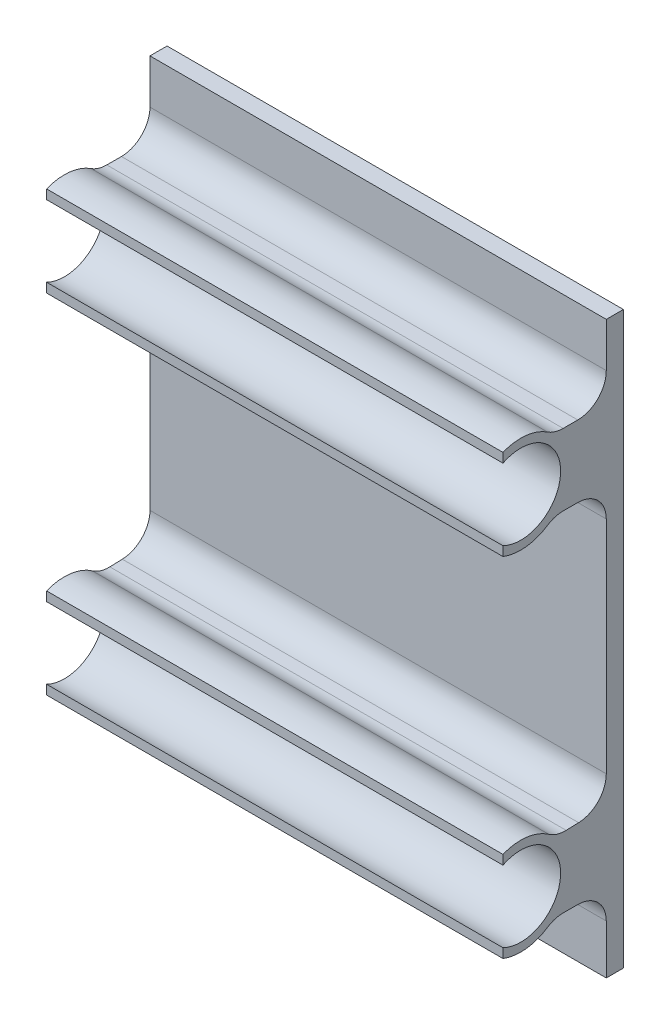
ISO-10303-21;
HEADER;
FILE_DESCRIPTION(('STEP AP214'),'2;1');
FILE_NAME('part.step','',(''),(''),'','','');
FILE_SCHEMA(('AUTOMOTIVE_DESIGN { 1 0 10303 214 1 1 1 1 }'));
ENDSEC;
DATA;
#1=APPLICATION_CONTEXT('core data for automotive mechanical design processes');
#2=APPLICATION_PROTOCOL_DEFINITION('international standard','automotive_design',2000,#1);
#3=PRODUCT_CONTEXT('',#1,'mechanical');
#4=PRODUCT('Part','Part','',(#3));
#5=PRODUCT_RELATED_PRODUCT_CATEGORY('part','',(#4));
#6=PRODUCT_DEFINITION_FORMATION('','',#4);
#7=PRODUCT_DEFINITION_CONTEXT('part definition',#1,'design');
#8=PRODUCT_DEFINITION('design','',#6,#7);
#9=PRODUCT_DEFINITION_SHAPE('','',#8);
#10=(LENGTH_UNIT() NAMED_UNIT(*) SI_UNIT(.MILLI.,.METRE.));
#11=(NAMED_UNIT(*) PLANE_ANGLE_UNIT() SI_UNIT($,.RADIAN.));
#12=(NAMED_UNIT(*) SI_UNIT($,.STERADIAN.) SOLID_ANGLE_UNIT());
#13=UNCERTAINTY_MEASURE_WITH_UNIT(LENGTH_MEASURE(1.E-05),#10,'distance_accuracy_value','');
#14=(GEOMETRIC_REPRESENTATION_CONTEXT(3) GLOBAL_UNCERTAINTY_ASSIGNED_CONTEXT((#13)) GLOBAL_UNIT_ASSIGNED_CONTEXT((#10,
#11,#12)) REPRESENTATION_CONTEXT('',''));
#15=CARTESIAN_POINT('',(0.,0.,0.));
#16=DIRECTION('',(0.,0.,1.));
#17=DIRECTION('',(1.,0.,0.));
#18=AXIS2_PLACEMENT_3D('',#15,#16,#17);
#19=CARTESIAN_POINT('',(0.,0.,3.));
#20=DIRECTION('',(0.,0.,-1.));
#21=DIRECTION('',(-1.,0.,0.));
#22=AXIS2_PLACEMENT_3D('',#19,#20,#21);
#23=PLANE('',#22);
#24=DIRECTION('',(0.,-1.,0.));
#25=VECTOR('',#24,1.);
#26=CARTESIAN_POINT('',(-21.5633463121759,-41.2326892611324,3.));
#27=LINE('',#26,#25);
#28=CARTESIAN_POINT('',(-21.5633463121759,28.4568046704941,3.));
#29=VERTEX_POINT('',#28);
#30=CARTESIAN_POINT('',(-21.5633463121759,-10.2291267439927,3.));
#31=VERTEX_POINT('',#30);
#32=EDGE_CURVE('E367',#29,#31,#27,.T.);
#33=ORIENTED_EDGE('',*,*,#32,.T.);
#34=DIRECTION('',(1.,0.,0.));
#35=VECTOR('',#34,1.);
#36=CARTESIAN_POINT('',(0.,-10.2291267439927,3.));
#37=LINE('',#36,#35);
#38=CARTESIAN_POINT('',(58.4366536878241,-10.2291267439927,3.));
#39=VERTEX_POINT('',#38);
#40=EDGE_CURVE('E466',#31,#39,#37,.T.);
#41=ORIENTED_EDGE('',*,*,#40,.T.);
#42=DIRECTION('',(0.,1.,0.));
#43=VECTOR('',#42,1.);
#44=CARTESIAN_POINT('',(58.4366536878241,58.7673107388676,3.));
#45=LINE('',#44,#43);
#46=CARTESIAN_POINT('',(58.4366536878241,28.4568046704941,3.));
#47=VERTEX_POINT('',#46);
#48=EDGE_CURVE('E377',#39,#47,#45,.T.);
#49=ORIENTED_EDGE('',*,*,#48,.T.);
#50=DIRECTION('',(-1.,0.,0.));
#51=VECTOR('',#50,1.);
#52=CARTESIAN_POINT('',(0.,28.4568046704941,3.));
#53=LINE('',#52,#51);
#54=EDGE_CURVE('E462',#47,#29,#53,.T.);
#55=ORIENTED_EDGE('',*,*,#54,.T.);
#56=EDGE_LOOP('',(#33,#41,#49,#55));
#57=FACE_BOUND('',#56,.T.);
#58=ADVANCED_FACE('F42',(#57),#23,.F.);
#59=CARTESIAN_POINT('',(-21.5633463121759,58.7673107388676,3.));
#60=VERTEX_POINT('',#59);
#61=CARTESIAN_POINT('',(-21.5633463121759,50.9913142501567,3.));
#62=VERTEX_POINT('',#61);
#63=EDGE_CURVE('E362',#60,#62,#27,.T.);
#64=ORIENTED_EDGE('',*,*,#63,.T.);
#65=DIRECTION('',(1.,0.,0.));
#66=VECTOR('',#65,1.);
#67=CARTESIAN_POINT('',(0.,50.9913142501567,3.));
#68=LINE('',#67,#66);
#69=CARTESIAN_POINT('',(58.4366536878241,50.9913142501567,3.));
#70=VERTEX_POINT('',#69);
#71=EDGE_CURVE('E483',#62,#70,#68,.T.);
#72=ORIENTED_EDGE('',*,*,#71,.T.);
#73=CARTESIAN_POINT('',(58.4366536878241,58.7673107388676,3.));
#74=VERTEX_POINT('',#73);
#75=EDGE_CURVE('E371',#70,#74,#45,.T.);
#76=ORIENTED_EDGE('',*,*,#75,.T.);
#77=DIRECTION('',(-1.,0.,0.));
#78=VECTOR('',#77,1.);
#79=CARTESIAN_POINT('',(-21.5633463121759,58.7673107388676,3.));
#80=LINE('',#79,#78);
#81=EDGE_CURVE('E376',#74,#60,#80,.T.);
#82=ORIENTED_EDGE('',*,*,#81,.T.);
#83=EDGE_LOOP('',(#64,#72,#76,#82));
#84=FACE_BOUND('',#83,.T.);
#85=ADVANCED_FACE('F576',(#84),#23,.F.);
#86=CARTESIAN_POINT('',(-21.5633463121759,-41.2326892611324,3.));
#87=DIRECTION('',(1.,0.,0.));
#88=DIRECTION('',(0.,0.,-1.));
#89=AXIS2_PLACEMENT_3D('',#86,#87,#88);
#90=PLANE('',#89);
#91=DIRECTION('',(0.,-0.0306969973347447,0.999528736132499));
#92=VECTOR('',#91,1.);
#93=CARTESIAN_POINT('',(-21.5633463121759,-15.0422169277016,1.83724571746385));
#94=LINE('',#93,#92);
#95=CARTESIAN_POINT('',(-21.5633463121759,-15.2267704246552,7.84651501332628));
#96=VERTEX_POINT('',#95);
#97=CARTESIAN_POINT('',(-21.5633463121759,-15.2940929711581,10.0386127968808));
#98=VERTEX_POINT('',#97);
#99=EDGE_CURVE('E283',#96,#98,#94,.T.);
#100=ORIENTED_EDGE('',*,*,#99,.F.);
#101=CARTESIAN_POINT('',(-21.5633463121759,-10.2291267439927,8.));
#102=DIRECTION('',(1.,0.,0.));
#103=DIRECTION('',(0.,0.,-1.));
#104=AXIS2_PLACEMENT_3D('',#101,#102,#103);
#105=CIRCLE('',#104,5.);
#106=EDGE_CURVE('E492',#96,#31,#105,.T.);
#107=ORIENTED_EDGE('',*,*,#106,.T.);
#108=ORIENTED_EDGE('',*,*,#32,.F.);
#109=CARTESIAN_POINT('',(-21.5633463121759,28.4568046704941,8.));
#110=DIRECTION('',(1.,0.,0.));
#111=DIRECTION('',(0.,0.,-1.));
#112=AXIS2_PLACEMENT_3D('',#109,#110,#111);
#113=CIRCLE('',#112,5.);
#114=CARTESIAN_POINT('',(-21.5633463121759,33.4568046704941,8.));
#115=VERTEX_POINT('',#114);
#116=EDGE_CURVE('E501',#29,#115,#113,.T.);
#117=ORIENTED_EDGE('',*,*,#116,.T.);
#118=DIRECTION('',(0.,0.,-1.));
#119=VECTOR('',#118,1.);
#120=CARTESIAN_POINT('',(-21.5633463121759,33.4568046704941,1.83724571746385));
#121=LINE('',#120,#119);
#122=CARTESIAN_POINT('',(-21.5633463121759,33.4568046704941,10.5636723108094));
#123=VERTEX_POINT('',#122);
#124=EDGE_CURVE('E310',#123,#115,#121,.T.);
#125=ORIENTED_EDGE('',*,*,#124,.F.);
#126=CARTESIAN_POINT('',(-21.5633463121759,28.4568046704941,10.5636723108094));
#127=DIRECTION('',(1.,0.,0.));
#128=DIRECTION('',(0.,0.,-1.));
#129=AXIS2_PLACEMENT_3D('',#126,#127,#128);
#130=CIRCLE('',#129,5.);
#131=CARTESIAN_POINT('',(-21.5633463121759,32.6298620000612,13.3178677512503));
#132=VERTEX_POINT('',#131);
#133=EDGE_CURVE('E452',#123,#132,#130,.T.);
#134=ORIENTED_EDGE('',*,*,#133,.T.);
#135=CARTESIAN_POINT('',(-21.5633463121759,39.7240594603254,18.));
#136=DIRECTION('',(1.,0.,0.));
#137=DIRECTION('',(0.,0.,-1.));
#138=AXIS2_PLACEMENT_3D('',#135,#136,#137);
#139=CIRCLE('',#138,8.5);
#140=CARTESIAN_POINT('',(-21.5633463121759,31.816564117256,21.1179347971593));
#141=VERTEX_POINT('',#140);
#142=EDGE_CURVE('E306',#141,#132,#139,.T.);
#143=ORIENTED_EDGE('',*,*,#142,.F.);
#144=DIRECTION('',(0.,-1.,0.));
#145=VECTOR('',#144,1.);
#146=CARTESIAN_POINT('',(-21.5633463121759,33.4568046704941,21.1179347971593));
#147=LINE('',#146,#145);
#148=CARTESIAN_POINT('',(-21.5633463121759,33.4568046704941,21.1179347971593));
#149=VERTEX_POINT('',#148);
#150=EDGE_CURVE('E301',#149,#141,#147,.T.);
#151=ORIENTED_EDGE('',*,*,#150,.F.);
#152=CARTESIAN_POINT('',(-21.5633463121759,39.7240594603254,18.));
#153=DIRECTION('',(-1.,0.,0.));
#154=DIRECTION('',(0.,0.,-1.));
#155=AXIS2_PLACEMENT_3D('',#152,#153,#154);
#156=CIRCLE('',#155,7.);
#157=CARTESIAN_POINT('',(-21.5633463121759,45.9913142501567,21.1179347971593));
#158=VERTEX_POINT('',#157);
#159=EDGE_CURVE('E297',#158,#149,#156,.T.);
#160=ORIENTED_EDGE('',*,*,#159,.F.);
#161=DIRECTION('',(0.,-1.,0.));
#162=VECTOR('',#161,1.);
#163=CARTESIAN_POINT('',(-21.5633463121759,47.6315548033947,21.1179347971593));
#164=LINE('',#163,#162);
#165=CARTESIAN_POINT('',(-21.5633463121759,47.6315548033947,21.1179347971593));
#166=VERTEX_POINT('',#165);
#167=EDGE_CURVE('E320',#166,#158,#164,.T.);
#168=ORIENTED_EDGE('',*,*,#167,.F.);
#169=CARTESIAN_POINT('',(-21.5633463121759,39.7240594603254,18.));
#170=DIRECTION('',(1.,0.,0.));
#171=DIRECTION('',(0.,0.,-1.));
#172=AXIS2_PLACEMENT_3D('',#169,#170,#171);
#173=CIRCLE('',#172,8.5);
#174=CARTESIAN_POINT('',(-21.5633463121759,46.8182569205895,13.3178677512503));
#175=VERTEX_POINT('',#174);
#176=EDGE_CURVE('E317',#175,#166,#173,.T.);
#177=ORIENTED_EDGE('',*,*,#176,.F.);
#178=CARTESIAN_POINT('',(-21.5633463121759,50.9913142501567,10.5636723108094));
#179=DIRECTION('',(1.,0.,0.));
#180=DIRECTION('',(0.,0.,-1.));
#181=AXIS2_PLACEMENT_3D('',#178,#179,#180);
#182=CIRCLE('',#181,5.);
#183=CARTESIAN_POINT('',(-21.5633463121759,45.9913142501567,10.5636723108094));
#184=VERTEX_POINT('',#183);
#185=EDGE_CURVE('E458',#175,#184,#182,.T.);
#186=ORIENTED_EDGE('',*,*,#185,.T.);
#187=DIRECTION('',(0.,0.,1.));
#188=VECTOR('',#187,1.);
#189=CARTESIAN_POINT('',(-21.5633463121759,45.9913142501567,1.83724571746385));
#190=LINE('',#189,#188);
#191=CARTESIAN_POINT('',(-21.5633463121759,45.9913142501567,8.));
#192=VERTEX_POINT('',#191);
#193=EDGE_CURVE('E314',#192,#184,#190,.T.);
#194=ORIENTED_EDGE('',*,*,#193,.F.);
#195=CARTESIAN_POINT('',(-21.5633463121759,50.9913142501567,8.));
#196=DIRECTION('',(1.,0.,0.));
#197=DIRECTION('',(0.,0.,-1.));
#198=AXIS2_PLACEMENT_3D('',#195,#196,#197);
#199=CIRCLE('',#198,5.);
#200=EDGE_CURVE('E11',#192,#62,#199,.T.);
#201=ORIENTED_EDGE('',*,*,#200,.T.);
#202=ORIENTED_EDGE('',*,*,#63,.F.);
#203=DIRECTION('',(0.,0.,-1.));
#204=VECTOR('',#203,1.);
#205=CARTESIAN_POINT('',(-21.5633463121759,58.7673107388676,3.));
#206=LINE('',#205,#204);
#207=CARTESIAN_POINT('',(-21.5633463121759,58.7673107388676,0.));
#208=VERTEX_POINT('',#207);
#209=EDGE_CURVE('E380',#60,#208,#206,.T.);
#210=ORIENTED_EDGE('',*,*,#209,.T.);
#211=DIRECTION('',(0.,-1.,0.));
#212=VECTOR('',#211,1.);
#213=CARTESIAN_POINT('',(-21.5633463121759,-41.2326892611324,0.));
#214=LINE('',#213,#212);
#215=CARTESIAN_POINT('',(-21.5633463121759,-41.2326892611324,0.));
#216=VERTEX_POINT('',#215);
#217=EDGE_CURVE('E352',#208,#216,#214,.T.);
#218=ORIENTED_EDGE('',*,*,#217,.T.);
#219=DIRECTION('',(0.,0.,-1.));
#220=VECTOR('',#219,1.);
#221=CARTESIAN_POINT('',(-21.5633463121759,-41.2326892611324,3.));
#222=LINE('',#221,#220);
#223=CARTESIAN_POINT('',(-21.5633463121759,-41.2326892611324,3.));
#224=VERTEX_POINT('',#223);
#225=EDGE_CURVE('E404',#224,#216,#222,.T.);
#226=ORIENTED_EDGE('',*,*,#225,.F.);
#227=CARTESIAN_POINT('',(-21.5633463121759,-32.5767265073642,3.));
#228=VERTEX_POINT('',#227);
#229=EDGE_CURVE('E368',#228,#224,#27,.T.);
#230=ORIENTED_EDGE('',*,*,#229,.F.);
#231=CARTESIAN_POINT('',(-21.5633463121759,-32.5767265073642,8.));
#232=DIRECTION('',(1.,0.,0.));
#233=DIRECTION('',(0.,0.,-1.));
#234=AXIS2_PLACEMENT_3D('',#231,#232,#233);
#235=CIRCLE('',#234,5.);
#236=CARTESIAN_POINT('',(-21.5633463121759,-27.5767265073642,8.));
#237=VERTEX_POINT('',#236);
#238=EDGE_CURVE('E495',#228,#237,#235,.T.);
#239=ORIENTED_EDGE('',*,*,#238,.T.);
#240=DIRECTION('',(0.,0.,-1.));
#241=VECTOR('',#240,1.);
#242=CARTESIAN_POINT('',(-21.5633463121759,-27.5767265073642,1.83724571746385));
#243=LINE('',#242,#241);
#244=CARTESIAN_POINT('',(-21.5633463121759,-27.5767265073642,10.5636723108093));
#245=VERTEX_POINT('',#244);
#246=EDGE_CURVE('E286',#245,#237,#243,.T.);
#247=ORIENTED_EDGE('',*,*,#246,.F.);
#248=CARTESIAN_POINT('',(-21.5633463121759,-32.5767265073642,10.5636723108093));
#249=DIRECTION('',(1.,0.,0.));
#250=DIRECTION('',(0.,0.,-1.));
#251=AXIS2_PLACEMENT_3D('',#248,#249,#250);
#252=CIRCLE('',#251,5.);
#253=CARTESIAN_POINT('',(-21.5633463121759,-28.4036691777971,13.3178677512503));
#254=VERTEX_POINT('',#253);
#255=EDGE_CURVE('E439',#245,#254,#252,.T.);
#256=ORIENTED_EDGE('',*,*,#255,.T.);
#257=CARTESIAN_POINT('',(-21.5633463121759,-21.3094717175329,18.));
#258=DIRECTION('',(1.,0.,0.));
#259=DIRECTION('',(0.,0.,-1.));
#260=AXIS2_PLACEMENT_3D('',#257,#258,#259);
#261=CIRCLE('',#260,8.5);
#262=CARTESIAN_POINT('',(-21.5633463121759,-29.2169670606023,21.1179347971593));
#263=VERTEX_POINT('',#262);
#264=EDGE_CURVE('E290',#263,#254,#261,.T.);
#265=ORIENTED_EDGE('',*,*,#264,.F.);
#266=DIRECTION('',(0.,-1.,0.));
#267=VECTOR('',#266,1.);
#268=CARTESIAN_POINT('',(-21.5633463121759,-27.5767265073642,21.1179347971593));
#269=LINE('',#268,#267);
#270=CARTESIAN_POINT('',(-21.5633463121759,-27.5767265073642,21.1179347971593));
#271=VERTEX_POINT('',#270);
#272=EDGE_CURVE('E262',#271,#263,#269,.T.);
#273=ORIENTED_EDGE('',*,*,#272,.F.);
#274=CARTESIAN_POINT('',(-21.5633463121759,-21.3094717175329,18.));
#275=DIRECTION('',(-1.,0.,0.));
#276=DIRECTION('',(0.,0.,-1.));
#277=AXIS2_PLACEMENT_3D('',#274,#275,#276);
#278=CIRCLE('',#277,7.);
#279=CARTESIAN_POINT('',(-21.5633463121759,-15.0422169277016,21.1179347971593));
#280=VERTEX_POINT('',#279);
#281=EDGE_CURVE('E256',#280,#271,#278,.T.);
#282=ORIENTED_EDGE('',*,*,#281,.F.);
#283=DIRECTION('',(0.,-1.,0.));
#284=VECTOR('',#283,1.);
#285=CARTESIAN_POINT('',(-21.5633463121759,-13.4019763744636,21.1179347971593));
#286=LINE('',#285,#284);
#287=CARTESIAN_POINT('',(-21.5633463121759,-13.4019763744636,21.1179347971593));
#288=VERTEX_POINT('',#287);
#289=EDGE_CURVE('E233',#288,#280,#286,.T.);
#290=ORIENTED_EDGE('',*,*,#289,.F.);
#291=CARTESIAN_POINT('',(-21.5633463121759,-21.3094717175329,18.));
#292=DIRECTION('',(1.,0.,0.));
#293=DIRECTION('',(0.,0.,-1.));
#294=AXIS2_PLACEMENT_3D('',#291,#292,#293);
#295=CIRCLE('',#294,8.5);
#296=CARTESIAN_POINT('',(-21.5633463121759,-14.3753464856946,13.0839134192751));
#297=VERTEX_POINT('',#296);
#298=EDGE_CURVE('E280',#297,#288,#295,.T.);
#299=ORIENTED_EDGE('',*,*,#298,.F.);
#300=CARTESIAN_POINT('',(-21.5633463121759,-10.2964492904956,10.1920977835546));
#301=DIRECTION('',(1.,0.,0.));
#302=DIRECTION('',(0.,0.,-1.));
#303=AXIS2_PLACEMENT_3D('',#300,#301,#302);
#304=CIRCLE('',#303,5.);
#305=EDGE_CURVE('E445',#297,#98,#304,.T.);
#306=ORIENTED_EDGE('',*,*,#305,.T.);
#307=EDGE_LOOP('',(#100,#107,#108,#117,#125,#134,#143,#151,#160,#168,#177,#186,#194,#201,#202,
#210,#218,#226,#230,#239,#247,#256,#265,#273,#282,#290,#299,#306));
#308=FACE_BOUND('',#307,.T.);
#309=ADVANCED_FACE('F525',(#308),#90,.F.);
#310=CARTESIAN_POINT('',(58.4366536878241,-41.2326892611324,3.));
#311=DIRECTION('',(0.,1.,0.));
#312=DIRECTION('',(-1.,0.,0.));
#313=AXIS2_PLACEMENT_3D('',#310,#311,#312);
#314=PLANE('',#313);
#315=DIRECTION('',(1.,0.,0.));
#316=VECTOR('',#315,1.);
#317=CARTESIAN_POINT('',(58.4366536878241,-41.2326892611324,0.));
#318=LINE('',#317,#316);
#319=CARTESIAN_POINT('',(58.4366536878241,-41.2326892611324,0.));
#320=VERTEX_POINT('',#319);
#321=EDGE_CURVE('E384',#216,#320,#318,.T.);
#322=ORIENTED_EDGE('',*,*,#321,.T.);
#323=DIRECTION('',(0.,0.,-1.));
#324=VECTOR('',#323,1.);
#325=CARTESIAN_POINT('',(58.4366536878241,-41.2326892611324,3.));
#326=LINE('',#325,#324);
#327=CARTESIAN_POINT('',(58.4366536878241,-41.2326892611324,3.));
#328=VERTEX_POINT('',#327);
#329=EDGE_CURVE('E400',#328,#320,#326,.T.);
#330=ORIENTED_EDGE('',*,*,#329,.F.);
#331=DIRECTION('',(1.,0.,0.));
#332=VECTOR('',#331,1.);
#333=CARTESIAN_POINT('',(58.4366536878241,-41.2326892611324,3.));
#334=LINE('',#333,#332);
#335=EDGE_CURVE('E366',#224,#328,#334,.T.);
#336=ORIENTED_EDGE('',*,*,#335,.F.);
#337=ORIENTED_EDGE('',*,*,#225,.T.);
#338=EDGE_LOOP('',(#322,#330,#336,#337));
#339=FACE_BOUND('',#338,.T.);
#340=ADVANCED_FACE('F522',(#339),#314,.F.);
#341=CARTESIAN_POINT('',(58.4366536878241,58.7673107388676,3.));
#342=DIRECTION('',(-1.,0.,0.));
#343=DIRECTION('',(0.,0.,1.));
#344=AXIS2_PLACEMENT_3D('',#341,#342,#343);
#345=PLANE('',#344);
#346=ORIENTED_EDGE('',*,*,#48,.F.);
#347=CARTESIAN_POINT('',(58.4366536878241,-10.2291267439927,8.));
#348=DIRECTION('',(-1.,0.,0.));
#349=DIRECTION('',(0.,0.,1.));
#350=AXIS2_PLACEMENT_3D('',#347,#348,#349);
#351=CIRCLE('',#350,5.);
#352=CARTESIAN_POINT('',(58.4366536878241,-15.2267704246552,7.84651501332628));
#353=VERTEX_POINT('',#352);
#354=EDGE_CURVE('E489',#39,#353,#351,.T.);
#355=ORIENTED_EDGE('',*,*,#354,.T.);
#356=DIRECTION('',(0.,-0.0306969973347447,0.999528736132499));
#357=VECTOR('',#356,1.);
#358=CARTESIAN_POINT('',(58.4366536878241,-15.0422169277016,1.83724571746385));
#359=LINE('',#358,#357);
#360=CARTESIAN_POINT('',(58.4366536878241,-15.2940929711581,10.0386127968808));
#361=VERTEX_POINT('',#360);
#362=EDGE_CURVE('E260',#353,#361,#359,.T.);
#363=ORIENTED_EDGE('',*,*,#362,.T.);
#364=CARTESIAN_POINT('',(58.4366536878241,-10.2964492904956,10.1920977835546));
#365=DIRECTION('',(-1.,0.,0.));
#366=DIRECTION('',(0.,0.,1.));
#367=AXIS2_PLACEMENT_3D('',#364,#365,#366);
#368=CIRCLE('',#367,5.);
#369=CARTESIAN_POINT('',(58.4366536878241,-14.3753464856946,13.0839134192751));
#370=VERTEX_POINT('',#369);
#371=EDGE_CURVE('E442',#361,#370,#368,.T.);
#372=ORIENTED_EDGE('',*,*,#371,.T.);
#373=CARTESIAN_POINT('',(58.4366536878241,-21.3094717175329,18.));
#374=DIRECTION('',(1.,0.,0.));
#375=DIRECTION('',(0.,0.,-1.));
#376=AXIS2_PLACEMENT_3D('',#373,#374,#375);
#377=CIRCLE('',#376,8.5);
#378=CARTESIAN_POINT('',(58.4366536878241,-13.4019763744636,21.1179347971593));
#379=VERTEX_POINT('',#378);
#380=EDGE_CURVE('E253',#370,#379,#377,.T.);
#381=ORIENTED_EDGE('',*,*,#380,.T.);
#382=DIRECTION('',(0.,-1.,0.));
#383=VECTOR('',#382,1.);
#384=CARTESIAN_POINT('',(58.4366536878241,-13.4019763744636,21.1179347971593));
#385=LINE('',#384,#383);
#386=CARTESIAN_POINT('',(58.4366536878241,-15.0422169277016,21.1179347971593));
#387=VERTEX_POINT('',#386);
#388=EDGE_CURVE('E231',#379,#387,#385,.T.);
#389=ORIENTED_EDGE('',*,*,#388,.T.);
#390=CARTESIAN_POINT('',(58.4366536878241,-21.3094717175329,18.));
#391=DIRECTION('',(-1.,0.,0.));
#392=DIRECTION('',(0.,0.,-1.));
#393=AXIS2_PLACEMENT_3D('',#390,#391,#392);
#394=CIRCLE('',#393,7.);
#395=CARTESIAN_POINT('',(58.4366536878241,-27.5767265073642,21.1179347971593));
#396=VERTEX_POINT('',#395);
#397=EDGE_CURVE('E241',#387,#396,#394,.T.);
#398=ORIENTED_EDGE('',*,*,#397,.T.);
#399=DIRECTION('',(0.,-1.,0.));
#400=VECTOR('',#399,1.);
#401=CARTESIAN_POINT('',(58.4366536878241,-27.5767265073642,21.1179347971593));
#402=LINE('',#401,#400);
#403=CARTESIAN_POINT('',(58.4366536878241,-29.2169670606023,21.1179347971593));
#404=VERTEX_POINT('',#403);
#405=EDGE_CURVE('E248',#396,#404,#402,.T.);
#406=ORIENTED_EDGE('',*,*,#405,.T.);
#407=CARTESIAN_POINT('',(58.4366536878241,-21.3094717175329,18.));
#408=DIRECTION('',(1.,0.,0.));
#409=DIRECTION('',(0.,0.,-1.));
#410=AXIS2_PLACEMENT_3D('',#407,#408,#409);
#411=CIRCLE('',#410,8.5);
#412=CARTESIAN_POINT('',(58.4366536878241,-28.4036691777971,13.3178677512503));
#413=VERTEX_POINT('',#412);
#414=EDGE_CURVE('E272',#404,#413,#411,.T.);
#415=ORIENTED_EDGE('',*,*,#414,.T.);
#416=CARTESIAN_POINT('',(58.4366536878241,-32.5767265073642,10.5636723108093));
#417=DIRECTION('',(-1.,0.,0.));
#418=DIRECTION('',(0.,0.,1.));
#419=AXIS2_PLACEMENT_3D('',#416,#417,#418);
#420=CIRCLE('',#419,5.);
#421=CARTESIAN_POINT('',(58.4366536878241,-27.5767265073642,10.5636723108093));
#422=VERTEX_POINT('',#421);
#423=EDGE_CURVE('E436',#413,#422,#420,.T.);
#424=ORIENTED_EDGE('',*,*,#423,.T.);
#425=DIRECTION('',(0.,0.,-1.));
#426=VECTOR('',#425,1.);
#427=CARTESIAN_POINT('',(58.4366536878241,-27.5767265073642,1.83724571746385));
#428=LINE('',#427,#426);
#429=CARTESIAN_POINT('',(58.4366536878241,-27.5767265073642,8.));
#430=VERTEX_POINT('',#429);
#431=EDGE_CURVE('E268',#422,#430,#428,.T.);
#432=ORIENTED_EDGE('',*,*,#431,.T.);
#433=CARTESIAN_POINT('',(58.4366536878241,-32.5767265073642,8.));
#434=DIRECTION('',(-1.,0.,0.));
#435=DIRECTION('',(0.,0.,1.));
#436=AXIS2_PLACEMENT_3D('',#433,#434,#435);
#437=CIRCLE('',#436,5.);
#438=CARTESIAN_POINT('',(58.4366536878241,-32.5767265073643,3.));
#439=VERTEX_POINT('',#438);
#440=EDGE_CURVE('E498',#430,#439,#437,.T.);
#441=ORIENTED_EDGE('',*,*,#440,.T.);
#442=EDGE_CURVE('E372',#328,#439,#45,.T.);
#443=ORIENTED_EDGE('',*,*,#442,.F.);
#444=ORIENTED_EDGE('',*,*,#329,.T.);
#445=DIRECTION('',(0.,1.,0.));
#446=VECTOR('',#445,1.);
#447=CARTESIAN_POINT('',(58.4366536878241,58.7673107388676,0.));
#448=LINE('',#447,#446);
#449=CARTESIAN_POINT('',(58.4366536878241,58.7673107388676,0.));
#450=VERTEX_POINT('',#449);
#451=EDGE_CURVE('E387',#320,#450,#448,.T.);
#452=ORIENTED_EDGE('',*,*,#451,.T.);
#453=DIRECTION('',(0.,0.,-1.));
#454=VECTOR('',#453,1.);
#455=CARTESIAN_POINT('',(58.4366536878241,58.7673107388676,3.));
#456=LINE('',#455,#454);
#457=EDGE_CURVE('E396',#74,#450,#456,.T.);
#458=ORIENTED_EDGE('',*,*,#457,.F.);
#459=ORIENTED_EDGE('',*,*,#75,.F.);
#460=CARTESIAN_POINT('',(58.4366536878241,50.9913142501567,8.));
#461=DIRECTION('',(-1.,0.,0.));
#462=DIRECTION('',(0.,0.,1.));
#463=AXIS2_PLACEMENT_3D('',#460,#461,#462);
#464=CIRCLE('',#463,5.);
#465=CARTESIAN_POINT('',(58.4366536878241,45.9913142501567,8.));
#466=VERTEX_POINT('',#465);
#467=EDGE_CURVE('E51',#70,#466,#464,.T.);
#468=ORIENTED_EDGE('',*,*,#467,.T.);
#469=DIRECTION('',(0.,0.,1.));
#470=VECTOR('',#469,1.);
#471=CARTESIAN_POINT('',(58.4366536878241,45.9913142501567,1.83724571746385));
#472=LINE('',#471,#470);
#473=CARTESIAN_POINT('',(58.4366536878241,45.9913142501567,10.5636723108094));
#474=VERTEX_POINT('',#473);
#475=EDGE_CURVE('E340',#466,#474,#472,.T.);
#476=ORIENTED_EDGE('',*,*,#475,.T.);
#477=CARTESIAN_POINT('',(58.4366536878241,50.9913142501567,10.5636723108094));
#478=DIRECTION('',(-1.,0.,0.));
#479=DIRECTION('',(0.,0.,1.));
#480=AXIS2_PLACEMENT_3D('',#477,#478,#479);
#481=CIRCLE('',#480,5.);
#482=CARTESIAN_POINT('',(58.4366536878241,46.8182569205895,13.3178677512503));
#483=VERTEX_POINT('',#482);
#484=EDGE_CURVE('E455',#474,#483,#481,.T.);
#485=ORIENTED_EDGE('',*,*,#484,.T.);
#486=CARTESIAN_POINT('',(58.4366536878241,39.7240594603254,18.));
#487=DIRECTION('',(1.,0.,0.));
#488=DIRECTION('',(0.,0.,-1.));
#489=AXIS2_PLACEMENT_3D('',#486,#487,#488);
#490=CIRCLE('',#489,8.5);
#491=CARTESIAN_POINT('',(58.4366536878241,47.6315548033947,21.1179347971593));
#492=VERTEX_POINT('',#491);
#493=EDGE_CURVE('E343',#483,#492,#490,.T.);
#494=ORIENTED_EDGE('',*,*,#493,.T.);
#495=DIRECTION('',(0.,-1.,0.));
#496=VECTOR('',#495,1.);
#497=CARTESIAN_POINT('',(58.4366536878241,47.6315548033947,21.1179347971593));
#498=LINE('',#497,#496);
#499=CARTESIAN_POINT('',(58.4366536878241,45.9913142501567,21.1179347971593));
#500=VERTEX_POINT('',#499);
#501=EDGE_CURVE('E302',#492,#500,#498,.T.);
#502=ORIENTED_EDGE('',*,*,#501,.T.);
#503=CARTESIAN_POINT('',(58.4366536878241,39.7240594603254,18.));
#504=DIRECTION('',(-1.,0.,0.));
#505=DIRECTION('',(0.,0.,-1.));
#506=AXIS2_PLACEMENT_3D('',#503,#504,#505);
#507=CIRCLE('',#506,7.);
#508=CARTESIAN_POINT('',(58.4366536878241,33.4568046704941,21.1179347971593));
#509=VERTEX_POINT('',#508);
#510=EDGE_CURVE('E247',#500,#509,#507,.T.);
#511=ORIENTED_EDGE('',*,*,#510,.T.);
#512=DIRECTION('',(0.,-1.,0.));
#513=VECTOR('',#512,1.);
#514=CARTESIAN_POINT('',(58.4366536878241,33.4568046704941,21.1179347971593));
#515=LINE('',#514,#513);
#516=CARTESIAN_POINT('',(58.4366536878241,31.816564117256,21.1179347971593));
#517=VERTEX_POINT('',#516);
#518=EDGE_CURVE('E328',#509,#517,#515,.T.);
#519=ORIENTED_EDGE('',*,*,#518,.T.);
#520=CARTESIAN_POINT('',(58.4366536878241,39.7240594603254,18.));
#521=DIRECTION('',(1.,0.,0.));
#522=DIRECTION('',(0.,0.,-1.));
#523=AXIS2_PLACEMENT_3D('',#520,#521,#522);
#524=CIRCLE('',#523,8.5);
#525=CARTESIAN_POINT('',(58.4366536878241,32.6298620000612,13.3178677512503));
#526=VERTEX_POINT('',#525);
#527=EDGE_CURVE('E332',#517,#526,#524,.T.);
#528=ORIENTED_EDGE('',*,*,#527,.T.);
#529=CARTESIAN_POINT('',(58.4366536878241,28.4568046704941,10.5636723108094));
#530=DIRECTION('',(-1.,0.,0.));
#531=DIRECTION('',(0.,0.,1.));
#532=AXIS2_PLACEMENT_3D('',#529,#530,#531);
#533=CIRCLE('',#532,5.);
#534=CARTESIAN_POINT('',(58.4366536878241,33.4568046704941,10.5636723108094));
#535=VERTEX_POINT('',#534);
#536=EDGE_CURVE('E449',#526,#535,#533,.T.);
#537=ORIENTED_EDGE('',*,*,#536,.T.);
#538=DIRECTION('',(0.,0.,-1.));
#539=VECTOR('',#538,1.);
#540=CARTESIAN_POINT('',(58.4366536878241,33.4568046704941,1.83724571746385));
#541=LINE('',#540,#539);
#542=CARTESIAN_POINT('',(58.4366536878241,33.4568046704941,8.));
#543=VERTEX_POINT('',#542);
#544=EDGE_CURVE('E336',#535,#543,#541,.T.);
#545=ORIENTED_EDGE('',*,*,#544,.T.);
#546=CARTESIAN_POINT('',(58.4366536878241,28.4568046704941,8.));
#547=DIRECTION('',(-1.,0.,0.));
#548=DIRECTION('',(0.,0.,1.));
#549=AXIS2_PLACEMENT_3D('',#546,#547,#548);
#550=CIRCLE('',#549,5.);
#551=EDGE_CURVE('E504',#543,#47,#550,.T.);
#552=ORIENTED_EDGE('',*,*,#551,.T.);
#553=EDGE_LOOP('',(#346,#355,#363,#372,#381,#389,#398,#406,#415,#424,#432,#441,#443,#444,#452,
#458,#459,#468,#476,#485,#494,#502,#511,#519,#528,#537,#545,#552));
#554=FACE_BOUND('',#553,.T.);
#555=ADVANCED_FACE('F251',(#554),#345,.F.);
#556=CARTESIAN_POINT('',(-21.5633463121759,58.7673107388676,3.));
#557=DIRECTION('',(0.,-1.,0.));
#558=DIRECTION('',(0.,0.,-1.));
#559=AXIS2_PLACEMENT_3D('',#556,#557,#558);
#560=PLANE('',#559);
#561=DIRECTION('',(-1.,0.,0.));
#562=VECTOR('',#561,1.);
#563=CARTESIAN_POINT('',(-21.5633463121759,58.7673107388676,0.));
#564=LINE('',#563,#562);
#565=EDGE_CURVE('E390',#450,#208,#564,.T.);
#566=ORIENTED_EDGE('',*,*,#565,.T.);
#567=ORIENTED_EDGE('',*,*,#209,.F.);
#568=ORIENTED_EDGE('',*,*,#81,.F.);
#569=ORIENTED_EDGE('',*,*,#457,.T.);
#570=EDGE_LOOP('',(#566,#567,#568,#569));
#571=FACE_BOUND('',#570,.T.);
#572=ADVANCED_FACE('F586',(#571),#560,.F.);
#573=ORIENTED_EDGE('',*,*,#442,.T.);
#574=DIRECTION('',(-1.,0.,0.));
#575=VECTOR('',#574,1.);
#576=CARTESIAN_POINT('',(0.,-32.5767265073642,3.));
#577=LINE('',#576,#575);
#578=EDGE_CURVE('E473',#439,#228,#577,.T.);
#579=ORIENTED_EDGE('',*,*,#578,.T.);
#580=ORIENTED_EDGE('',*,*,#229,.T.);
#581=ORIENTED_EDGE('',*,*,#335,.T.);
#582=EDGE_LOOP('',(#573,#579,#580,#581));
#583=FACE_BOUND('',#582,.T.);
#584=ADVANCED_FACE('F516',(#583),#23,.F.);
#585=CARTESIAN_POINT('',(0.,0.,0.));
#586=DIRECTION('',(0.,0.,-1.));
#587=DIRECTION('',(-1.,0.,0.));
#588=AXIS2_PLACEMENT_3D('',#585,#586,#587);
#589=PLANE('',#588);
#590=ORIENTED_EDGE('',*,*,#217,.F.);
#591=ORIENTED_EDGE('',*,*,#565,.F.);
#592=ORIENTED_EDGE('',*,*,#451,.F.);
#593=ORIENTED_EDGE('',*,*,#321,.F.);
#594=EDGE_LOOP('',(#590,#591,#592,#593));
#595=FACE_BOUND('',#594,.T.);
#596=ADVANCED_FACE('F531',(#595),#589,.T.);
#597=CARTESIAN_POINT('',(-21.5633463121759,45.9913142501567,1.83724571746385));
#598=DIRECTION('',(0.,1.,0.));
#599=DIRECTION('',(0.,0.,1.));
#600=AXIS2_PLACEMENT_3D('',#597,#598,#599);
#601=PLANE('',#600);
#602=ORIENTED_EDGE('',*,*,#475,.F.);
#603=DIRECTION('',(1.,0.,0.));
#604=VECTOR('',#603,1.);
#605=CARTESIAN_POINT('',(-21.5633463121759,45.9913142501567,8.));
#606=LINE('',#605,#604);
#607=EDGE_CURVE('E64',#466,#192,#606,.F.);
#608=ORIENTED_EDGE('',*,*,#607,.T.);
#609=ORIENTED_EDGE('',*,*,#193,.T.);
#610=DIRECTION('',(-1.,0.,0.));
#611=VECTOR('',#610,1.);
#612=CARTESIAN_POINT('',(58.4366536878241,45.9913142501567,10.5636723108094));
#613=LINE('',#612,#611);
#614=EDGE_CURVE('E429',#184,#474,#613,.F.);
#615=ORIENTED_EDGE('',*,*,#614,.T.);
#616=EDGE_LOOP('',(#602,#608,#609,#615));
#617=FACE_BOUND('',#616,.T.);
#618=ADVANCED_FACE('F591',(#617),#601,.T.);
#619=CARTESIAN_POINT('',(-21.5633463121759,33.4568046704941,1.83724571746385));
#620=DIRECTION('',(0.,-1.,0.));
#621=DIRECTION('',(0.,0.,-1.));
#622=AXIS2_PLACEMENT_3D('',#619,#620,#621);
#623=PLANE('',#622);
#624=ORIENTED_EDGE('',*,*,#124,.T.);
#625=DIRECTION('',(-1.,0.,0.));
#626=VECTOR('',#625,1.);
#627=CARTESIAN_POINT('',(-21.5633463121759,33.4568046704941,8.));
#628=LINE('',#627,#626);
#629=EDGE_CURVE('E480',#115,#543,#628,.F.);
#630=ORIENTED_EDGE('',*,*,#629,.T.);
#631=ORIENTED_EDGE('',*,*,#544,.F.);
#632=DIRECTION('',(-1.,0.,0.));
#633=VECTOR('',#632,1.);
#634=CARTESIAN_POINT('',(-21.5633463121759,33.4568046704941,10.5636723108094));
#635=LINE('',#634,#633);
#636=EDGE_CURVE('E426',#535,#123,#635,.T.);
#637=ORIENTED_EDGE('',*,*,#636,.T.);
#638=EDGE_LOOP('',(#624,#630,#631,#637));
#639=FACE_BOUND('',#638,.T.);
#640=ADVANCED_FACE('F642',(#639),#623,.T.);
#641=CARTESIAN_POINT('',(-21.5633463121759,39.7240594603254,18.));
#642=DIRECTION('',(1.,0.,0.));
#643=DIRECTION('',(0.,0.,-1.));
#644=AXIS2_PLACEMENT_3D('',#641,#642,#643);
#645=CYLINDRICAL_SURFACE('',#644,7.);
#646=ORIENTED_EDGE('',*,*,#510,.F.);
#647=DIRECTION('',(1.,0.,0.));
#648=VECTOR('',#647,1.);
#649=CARTESIAN_POINT('',(-21.5633463121759,45.9913142501567,21.1179347971593));
#650=LINE('',#649,#648);
#651=EDGE_CURVE('E349',#158,#500,#650,.T.);
#652=ORIENTED_EDGE('',*,*,#651,.F.);
#653=ORIENTED_EDGE('',*,*,#159,.T.);
#654=DIRECTION('',(1.,0.,0.));
#655=VECTOR('',#654,1.);
#656=CARTESIAN_POINT('',(-21.5633463121759,33.4568046704941,21.1179347971593));
#657=LINE('',#656,#655);
#658=EDGE_CURVE('E324',#149,#509,#657,.T.);
#659=ORIENTED_EDGE('',*,*,#658,.T.);
#660=EDGE_LOOP('',(#646,#652,#653,#659));
#661=FACE_BOUND('',#660,.T.);
#662=ADVANCED_FACE('F657',(#661),#645,.F.);
#663=CARTESIAN_POINT('',(-21.5633463121759,47.6315548033947,21.1179347971593));
#664=DIRECTION('',(0.,0.,1.));
#665=DIRECTION('',(1.,0.,0.));
#666=AXIS2_PLACEMENT_3D('',#663,#664,#665);
#667=PLANE('',#666);
#668=ORIENTED_EDGE('',*,*,#501,.F.);
#669=DIRECTION('',(1.,0.,0.));
#670=VECTOR('',#669,1.);
#671=CARTESIAN_POINT('',(-21.5633463121759,47.6315548033947,21.1179347971593));
#672=LINE('',#671,#670);
#673=EDGE_CURVE('E353',#166,#492,#672,.T.);
#674=ORIENTED_EDGE('',*,*,#673,.F.);
#675=ORIENTED_EDGE('',*,*,#167,.T.);
#676=ORIENTED_EDGE('',*,*,#651,.T.);
#677=EDGE_LOOP('',(#668,#674,#675,#676));
#678=FACE_BOUND('',#677,.T.);
#679=ADVANCED_FACE('F660',(#678),#667,.T.);
#680=CARTESIAN_POINT('',(-21.5633463121759,39.7240594603254,18.));
#681=DIRECTION('',(1.,0.,0.));
#682=DIRECTION('',(0.,0.,-1.));
#683=AXIS2_PLACEMENT_3D('',#680,#681,#682);
#684=CYLINDRICAL_SURFACE('',#683,8.5);
#685=ORIENTED_EDGE('',*,*,#493,.F.);
#686=DIRECTION('',(1.,0.,0.));
#687=VECTOR('',#686,1.);
#688=CARTESIAN_POINT('',(-21.5633463121759,46.8182569205895,13.3178677512503));
#689=LINE('',#688,#687);
#690=EDGE_CURVE('E433',#483,#175,#689,.F.);
#691=ORIENTED_EDGE('',*,*,#690,.T.);
#692=ORIENTED_EDGE('',*,*,#176,.T.);
#693=ORIENTED_EDGE('',*,*,#673,.T.);
#694=EDGE_LOOP('',(#685,#691,#692,#693));
#695=FACE_BOUND('',#694,.T.);
#696=ADVANCED_FACE('F672',(#695),#684,.T.);
#697=CARTESIAN_POINT('',(-21.5633463121759,39.7240594603254,18.));
#698=DIRECTION('',(1.,0.,0.));
#699=DIRECTION('',(0.,0.,-1.));
#700=AXIS2_PLACEMENT_3D('',#697,#698,#699);
#701=CYLINDRICAL_SURFACE('',#700,8.5);
#702=ORIENTED_EDGE('',*,*,#142,.T.);
#703=DIRECTION('',(1.,0.,0.));
#704=VECTOR('',#703,1.);
#705=CARTESIAN_POINT('',(-21.5633463121759,32.6298620000612,13.3178677512503));
#706=LINE('',#705,#704);
#707=EDGE_CURVE('E422',#132,#526,#706,.T.);
#708=ORIENTED_EDGE('',*,*,#707,.T.);
#709=ORIENTED_EDGE('',*,*,#527,.F.);
#710=DIRECTION('',(1.,0.,0.));
#711=VECTOR('',#710,1.);
#712=CARTESIAN_POINT('',(-21.5633463121759,31.816564117256,21.1179347971593));
#713=LINE('',#712,#711);
#714=EDGE_CURVE('E357',#141,#517,#713,.T.);
#715=ORIENTED_EDGE('',*,*,#714,.F.);
#716=EDGE_LOOP('',(#702,#708,#709,#715));
#717=FACE_BOUND('',#716,.T.);
#718=ADVANCED_FACE('F648',(#717),#701,.T.);
#719=CARTESIAN_POINT('',(-21.5633463121759,33.4568046704941,21.1179347971593));
#720=DIRECTION('',(0.,0.,1.));
#721=DIRECTION('',(0.,-1.,0.));
#722=AXIS2_PLACEMENT_3D('',#719,#720,#721);
#723=PLANE('',#722);
#724=ORIENTED_EDGE('',*,*,#518,.F.);
#725=ORIENTED_EDGE('',*,*,#658,.F.);
#726=ORIENTED_EDGE('',*,*,#150,.T.);
#727=ORIENTED_EDGE('',*,*,#714,.T.);
#728=EDGE_LOOP('',(#724,#725,#726,#727));
#729=FACE_BOUND('',#728,.T.);
#730=ADVANCED_FACE('F652',(#729),#723,.T.);
#731=CARTESIAN_POINT('',(-21.5633463121759,-15.0422169277016,1.83724571746385));
#732=DIRECTION('',(0.,0.999528736132499,0.0306969973347447));
#733=DIRECTION('',(0.,-0.0306969973347447,0.999528736132499));
#734=AXIS2_PLACEMENT_3D('',#731,#732,#733);
#735=PLANE('',#734);
#736=ORIENTED_EDGE('',*,*,#362,.F.);
#737=DIRECTION('',(1.,0.,0.));
#738=VECTOR('',#737,1.);
#739=CARTESIAN_POINT('',(-21.5633463121759,-15.2267704246552,7.84651501332628));
#740=LINE('',#739,#738);
#741=EDGE_CURVE('E470',#353,#96,#740,.F.);
#742=ORIENTED_EDGE('',*,*,#741,.T.);
#743=ORIENTED_EDGE('',*,*,#99,.T.);
#744=DIRECTION('',(-1.,0.,0.));
#745=VECTOR('',#744,1.);
#746=CARTESIAN_POINT('',(58.4366536878241,-15.2940929711581,10.0386127968808));
#747=LINE('',#746,#745);
#748=EDGE_CURVE('E415',#98,#361,#747,.F.);
#749=ORIENTED_EDGE('',*,*,#748,.T.);
#750=EDGE_LOOP('',(#736,#742,#743,#749));
#751=FACE_BOUND('',#750,.T.);
#752=ADVANCED_FACE('F637',(#751),#735,.T.);
#753=CARTESIAN_POINT('',(-21.5633463121759,-27.5767265073642,1.83724571746385));
#754=DIRECTION('',(0.,-1.,0.));
#755=DIRECTION('',(0.,0.,-1.));
#756=AXIS2_PLACEMENT_3D('',#753,#754,#755);
#757=PLANE('',#756);
#758=ORIENTED_EDGE('',*,*,#246,.T.);
#759=DIRECTION('',(-1.,0.,0.));
#760=VECTOR('',#759,1.);
#761=CARTESIAN_POINT('',(-21.5633463121759,-27.5767265073642,8.));
#762=LINE('',#761,#760);
#763=EDGE_CURVE('E477',#237,#430,#762,.F.);
#764=ORIENTED_EDGE('',*,*,#763,.T.);
#765=ORIENTED_EDGE('',*,*,#431,.F.);
#766=DIRECTION('',(-1.,0.,0.));
#767=VECTOR('',#766,1.);
#768=CARTESIAN_POINT('',(-21.5633463121759,-27.5767265073642,10.5636723108093));
#769=LINE('',#768,#767);
#770=EDGE_CURVE('E412',#422,#245,#769,.T.);
#771=ORIENTED_EDGE('',*,*,#770,.T.);
#772=EDGE_LOOP('',(#758,#764,#765,#771));
#773=FACE_BOUND('',#772,.T.);
#774=ADVANCED_FACE('F541',(#773),#757,.T.);
#775=CARTESIAN_POINT('',(-21.5633463121759,-21.3094717175329,18.));
#776=DIRECTION('',(1.,0.,0.));
#777=DIRECTION('',(0.,0.,-1.));
#778=AXIS2_PLACEMENT_3D('',#775,#776,#777);
#779=CYLINDRICAL_SURFACE('',#778,7.);
#780=ORIENTED_EDGE('',*,*,#397,.F.);
#781=DIRECTION('',(1.,0.,0.));
#782=VECTOR('',#781,1.);
#783=CARTESIAN_POINT('',(-21.5633463121759,-15.0422169277016,21.1179347971593));
#784=LINE('',#783,#782);
#785=EDGE_CURVE('E226',#280,#387,#784,.T.);
#786=ORIENTED_EDGE('',*,*,#785,.F.);
#787=ORIENTED_EDGE('',*,*,#281,.T.);
#788=DIRECTION('',(1.,0.,0.));
#789=VECTOR('',#788,1.);
#790=CARTESIAN_POINT('',(-21.5633463121759,-27.5767265073642,21.1179347971593));
#791=LINE('',#790,#789);
#792=EDGE_CURVE('E243',#271,#396,#791,.T.);
#793=ORIENTED_EDGE('',*,*,#792,.T.);
#794=EDGE_LOOP('',(#780,#786,#787,#793));
#795=FACE_BOUND('',#794,.T.);
#796=ADVANCED_FACE('F242',(#795),#779,.F.);
#797=CARTESIAN_POINT('',(-21.5633463121759,-13.4019763744636,21.1179347971593));
#798=DIRECTION('',(0.,0.,1.));
#799=DIRECTION('',(1.,0.,0.));
#800=AXIS2_PLACEMENT_3D('',#797,#798,#799);
#801=PLANE('',#800);
#802=ORIENTED_EDGE('',*,*,#388,.F.);
#803=DIRECTION('',(1.,0.,0.));
#804=VECTOR('',#803,1.);
#805=CARTESIAN_POINT('',(-21.5633463121759,-13.4019763744636,21.1179347971593));
#806=LINE('',#805,#804);
#807=EDGE_CURVE('E238',#288,#379,#806,.T.);
#808=ORIENTED_EDGE('',*,*,#807,.F.);
#809=ORIENTED_EDGE('',*,*,#289,.T.);
#810=ORIENTED_EDGE('',*,*,#785,.T.);
#811=EDGE_LOOP('',(#802,#808,#809,#810));
#812=FACE_BOUND('',#811,.T.);
#813=ADVANCED_FACE('F228',(#812),#801,.T.);
#814=CARTESIAN_POINT('',(-21.5633463121759,-21.3094717175329,18.));
#815=DIRECTION('',(1.,0.,0.));
#816=DIRECTION('',(0.,0.,-1.));
#817=AXIS2_PLACEMENT_3D('',#814,#815,#816);
#818=CYLINDRICAL_SURFACE('',#817,8.5);
#819=ORIENTED_EDGE('',*,*,#380,.F.);
#820=DIRECTION('',(1.,0.,0.));
#821=VECTOR('',#820,1.);
#822=CARTESIAN_POINT('',(-21.5633463121759,-14.3753464856946,13.0839134192751));
#823=LINE('',#822,#821);
#824=EDGE_CURVE('E419',#370,#297,#823,.F.);
#825=ORIENTED_EDGE('',*,*,#824,.T.);
#826=ORIENTED_EDGE('',*,*,#298,.T.);
#827=ORIENTED_EDGE('',*,*,#807,.T.);
#828=EDGE_LOOP('',(#819,#825,#826,#827));
#829=FACE_BOUND('',#828,.T.);
#830=ADVANCED_FACE('F560',(#829),#818,.T.);
#831=CARTESIAN_POINT('',(-21.5633463121759,-21.3094717175329,18.));
#832=DIRECTION('',(1.,0.,0.));
#833=DIRECTION('',(0.,0.,-1.));
#834=AXIS2_PLACEMENT_3D('',#831,#832,#833);
#835=CYLINDRICAL_SURFACE('',#834,8.5);
#836=ORIENTED_EDGE('',*,*,#264,.T.);
#837=DIRECTION('',(1.,0.,0.));
#838=VECTOR('',#837,1.);
#839=CARTESIAN_POINT('',(-21.5633463121759,-28.4036691777971,13.3178677512503));
#840=LINE('',#839,#838);
#841=EDGE_CURVE('E408',#254,#413,#840,.T.);
#842=ORIENTED_EDGE('',*,*,#841,.T.);
#843=ORIENTED_EDGE('',*,*,#414,.F.);
#844=DIRECTION('',(1.,0.,0.));
#845=VECTOR('',#844,1.);
#846=CARTESIAN_POINT('',(-21.5633463121759,-29.2169670606023,21.1179347971593));
#847=LINE('',#846,#845);
#848=EDGE_CURVE('E552',#263,#404,#847,.T.);
#849=ORIENTED_EDGE('',*,*,#848,.F.);
#850=EDGE_LOOP('',(#836,#842,#843,#849));
#851=FACE_BOUND('',#850,.T.);
#852=ADVANCED_FACE('F550',(#851),#835,.T.);
#853=CARTESIAN_POINT('',(-21.5633463121759,-27.5767265073642,21.1179347971593));
#854=DIRECTION('',(0.,0.,1.));
#855=DIRECTION('',(0.,-1.,0.));
#856=AXIS2_PLACEMENT_3D('',#853,#854,#855);
#857=PLANE('',#856);
#858=ORIENTED_EDGE('',*,*,#405,.F.);
#859=ORIENTED_EDGE('',*,*,#792,.F.);
#860=ORIENTED_EDGE('',*,*,#272,.T.);
#861=ORIENTED_EDGE('',*,*,#848,.T.);
#862=EDGE_LOOP('',(#858,#859,#860,#861));
#863=FACE_BOUND('',#862,.T.);
#864=ADVANCED_FACE('F564',(#863),#857,.T.);
#865=CARTESIAN_POINT('',(-21.5633463121759,-32.5767265073642,10.5636723108093));
#866=DIRECTION('',(1.,0.,0.));
#867=DIRECTION('',(0.,0.,-1.));
#868=AXIS2_PLACEMENT_3D('',#865,#866,#867);
#869=CYLINDRICAL_SURFACE('',#868,5.);
#870=ORIENTED_EDGE('',*,*,#255,.F.);
#871=ORIENTED_EDGE('',*,*,#770,.F.);
#872=ORIENTED_EDGE('',*,*,#423,.F.);
#873=ORIENTED_EDGE('',*,*,#841,.F.);
#874=EDGE_LOOP('',(#870,#871,#872,#873));
#875=FACE_BOUND('',#874,.T.);
#876=ADVANCED_FACE('F545',(#875),#869,.F.);
#877=CARTESIAN_POINT('',(-21.5633463121759,-10.2964492904956,10.1920977835546));
#878=DIRECTION('',(1.,0.,0.));
#879=DIRECTION('',(0.,0.,-1.));
#880=AXIS2_PLACEMENT_3D('',#877,#878,#879);
#881=CYLINDRICAL_SURFACE('',#880,5.);
#882=ORIENTED_EDGE('',*,*,#305,.F.);
#883=ORIENTED_EDGE('',*,*,#824,.F.);
#884=ORIENTED_EDGE('',*,*,#371,.F.);
#885=ORIENTED_EDGE('',*,*,#748,.F.);
#886=EDGE_LOOP('',(#882,#883,#884,#885));
#887=FACE_BOUND('',#886,.T.);
#888=ADVANCED_FACE('F571',(#887),#881,.F.);
#889=CARTESIAN_POINT('',(-21.5633463121759,28.4568046704941,10.5636723108094));
#890=DIRECTION('',(1.,0.,0.));
#891=DIRECTION('',(0.,0.,-1.));
#892=AXIS2_PLACEMENT_3D('',#889,#890,#891);
#893=CYLINDRICAL_SURFACE('',#892,5.);
#894=ORIENTED_EDGE('',*,*,#133,.F.);
#895=ORIENTED_EDGE('',*,*,#636,.F.);
#896=ORIENTED_EDGE('',*,*,#536,.F.);
#897=ORIENTED_EDGE('',*,*,#707,.F.);
#898=EDGE_LOOP('',(#894,#895,#896,#897));
#899=FACE_BOUND('',#898,.T.);
#900=ADVANCED_FACE('F605',(#899),#893,.F.);
#901=CARTESIAN_POINT('',(-21.5633463121759,50.9913142501567,10.5636723108094));
#902=DIRECTION('',(1.,0.,0.));
#903=DIRECTION('',(0.,0.,-1.));
#904=AXIS2_PLACEMENT_3D('',#901,#902,#903);
#905=CYLINDRICAL_SURFACE('',#904,5.);
#906=ORIENTED_EDGE('',*,*,#185,.F.);
#907=ORIENTED_EDGE('',*,*,#690,.F.);
#908=ORIENTED_EDGE('',*,*,#484,.F.);
#909=ORIENTED_EDGE('',*,*,#614,.F.);
#910=EDGE_LOOP('',(#906,#907,#908,#909));
#911=FACE_BOUND('',#910,.T.);
#912=ADVANCED_FACE('F609',(#911),#905,.F.);
#913=CARTESIAN_POINT('',(0.,-10.2291267439927,8.));
#914=DIRECTION('',(1.,0.,0.));
#915=DIRECTION('',(0.,0.,-1.));
#916=AXIS2_PLACEMENT_3D('',#913,#914,#915);
#917=CYLINDRICAL_SURFACE('',#916,5.);
#918=ORIENTED_EDGE('',*,*,#106,.F.);
#919=ORIENTED_EDGE('',*,*,#741,.F.);
#920=ORIENTED_EDGE('',*,*,#354,.F.);
#921=ORIENTED_EDGE('',*,*,#40,.F.);
#922=EDGE_LOOP('',(#918,#919,#920,#921));
#923=FACE_BOUND('',#922,.T.);
#924=ADVANCED_FACE('F613',(#923),#917,.F.);
#925=CARTESIAN_POINT('',(0.,-32.5767265073642,8.));
#926=DIRECTION('',(-1.,0.,0.));
#927=DIRECTION('',(0.,0.,1.));
#928=AXIS2_PLACEMENT_3D('',#925,#926,#927);
#929=CYLINDRICAL_SURFACE('',#928,5.);
#930=ORIENTED_EDGE('',*,*,#440,.F.);
#931=ORIENTED_EDGE('',*,*,#763,.F.);
#932=ORIENTED_EDGE('',*,*,#238,.F.);
#933=ORIENTED_EDGE('',*,*,#578,.F.);
#934=EDGE_LOOP('',(#930,#931,#932,#933));
#935=FACE_BOUND('',#934,.T.);
#936=ADVANCED_FACE('F536',(#935),#929,.F.);
#937=CARTESIAN_POINT('',(0.,28.4568046704941,8.));
#938=DIRECTION('',(-1.,0.,0.));
#939=DIRECTION('',(0.,0.,1.));
#940=AXIS2_PLACEMENT_3D('',#937,#938,#939);
#941=CYLINDRICAL_SURFACE('',#940,5.);
#942=ORIENTED_EDGE('',*,*,#551,.F.);
#943=ORIENTED_EDGE('',*,*,#629,.F.);
#944=ORIENTED_EDGE('',*,*,#116,.F.);
#945=ORIENTED_EDGE('',*,*,#54,.F.);
#946=EDGE_LOOP('',(#942,#943,#944,#945));
#947=FACE_BOUND('',#946,.T.);
#948=ADVANCED_FACE('F619',(#947),#941,.F.);
#949=CARTESIAN_POINT('',(0.,50.9913142501567,8.));
#950=DIRECTION('',(1.,0.,0.));
#951=DIRECTION('',(0.,0.,-1.));
#952=AXIS2_PLACEMENT_3D('',#949,#950,#951);
#953=CYLINDRICAL_SURFACE('',#952,5.);
#954=ORIENTED_EDGE('',*,*,#200,.F.);
#955=ORIENTED_EDGE('',*,*,#607,.F.);
#956=ORIENTED_EDGE('',*,*,#467,.F.);
#957=ORIENTED_EDGE('',*,*,#71,.F.);
#958=EDGE_LOOP('',(#954,#955,#956,#957));
#959=FACE_BOUND('',#958,.T.);
#960=ADVANCED_FACE('F44',(#959),#953,.F.);
#961=CLOSED_SHELL('',(#58,#85,#309,#340,#555,#572,#584,#596,#618,#640,#662,#679,#696,#718,#730,
#752,#774,#796,#813,#830,#852,#864,#876,#888,#900,#912,#924,#936,#948,#960));
#962=MANIFOLD_SOLID_BREP('B2',#961);
#963=ADVANCED_BREP_SHAPE_REPRESENTATION('',(#18,#962),#14);
#964=SHAPE_DEFINITION_REPRESENTATION(#9,#963);
ENDSEC;
END-ISO-10303-21;
